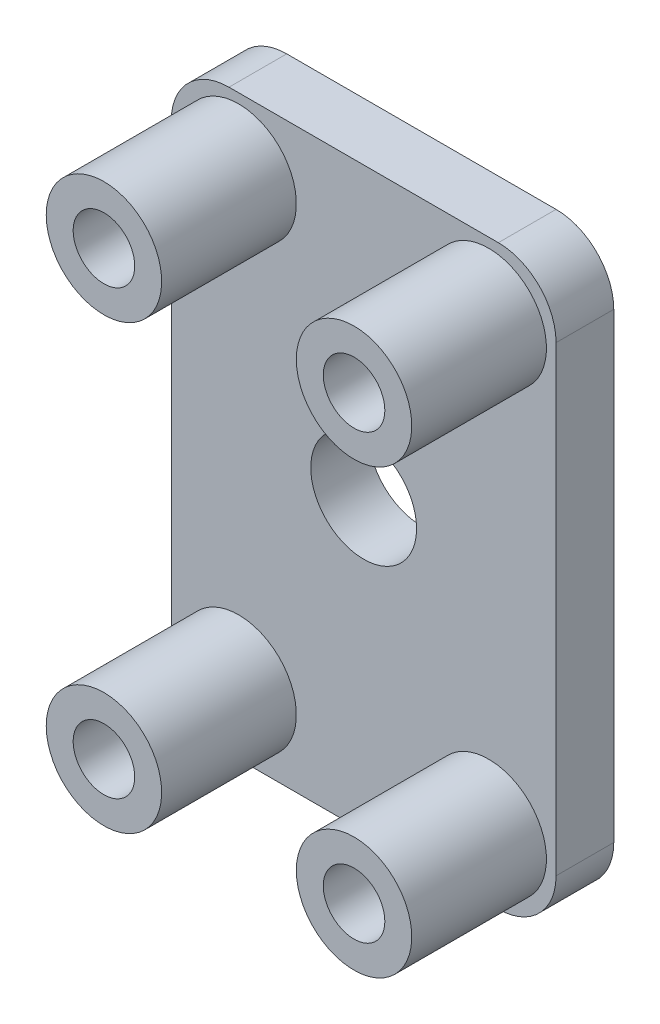
ISO-10303-21;
HEADER;
FILE_DESCRIPTION(('STEP AP214'),'2;1');
FILE_NAME('part.step','',(''),(''),'','','');
FILE_SCHEMA(('AUTOMOTIVE_DESIGN { 1 0 10303 214 1 1 1 1 }'));
ENDSEC;
DATA;
#1=APPLICATION_CONTEXT('core data for automotive mechanical design processes');
#2=APPLICATION_PROTOCOL_DEFINITION('international standard','automotive_design',2000,#1);
#3=PRODUCT_CONTEXT('',#1,'mechanical');
#4=PRODUCT('Part','Part','',(#3));
#5=PRODUCT_RELATED_PRODUCT_CATEGORY('part','',(#4));
#6=PRODUCT_DEFINITION_FORMATION('','',#4);
#7=PRODUCT_DEFINITION_CONTEXT('part definition',#1,'design');
#8=PRODUCT_DEFINITION('design','',#6,#7);
#9=PRODUCT_DEFINITION_SHAPE('','',#8);
#10=(LENGTH_UNIT() NAMED_UNIT(*) SI_UNIT(.MILLI.,.METRE.));
#11=(NAMED_UNIT(*) PLANE_ANGLE_UNIT() SI_UNIT($,.RADIAN.));
#12=(NAMED_UNIT(*) SI_UNIT($,.STERADIAN.) SOLID_ANGLE_UNIT());
#13=UNCERTAINTY_MEASURE_WITH_UNIT(LENGTH_MEASURE(1.E-05),#10,'distance_accuracy_value','');
#14=(GEOMETRIC_REPRESENTATION_CONTEXT(3) GLOBAL_UNCERTAINTY_ASSIGNED_CONTEXT((#13)) GLOBAL_UNIT_ASSIGNED_CONTEXT((#10,
#11,#12)) REPRESENTATION_CONTEXT('',''));
#15=CARTESIAN_POINT('',(0.,0.,0.));
#16=DIRECTION('',(0.,0.,1.));
#17=DIRECTION('',(1.,0.,0.));
#18=AXIS2_PLACEMENT_3D('',#15,#16,#17);
#19=CARTESIAN_POINT('',(0.,0.,3.));
#20=DIRECTION('',(0.,0.,-1.));
#21=DIRECTION('',(-1.,0.,0.));
#22=AXIS2_PLACEMENT_3D('',#19,#20,#21);
#23=PLANE('',#22);
#24=CARTESIAN_POINT('',(0.,0.,3.));
#25=DIRECTION('',(0.,0.,1.));
#26=DIRECTION('',(1.,0.,0.));
#27=AXIS2_PLACEMENT_3D('',#24,#25,#26);
#28=CIRCLE('',#27,2.75);
#29=CARTESIAN_POINT('',(2.75,0.,3.));
#30=VERTEX_POINT('',#29);
#31=EDGE_CURVE('E205',#30,#30,#28,.T.);
#32=ORIENTED_EDGE('',*,*,#31,.F.);
#33=EDGE_LOOP('',(#32));
#34=FACE_BOUND('',#33,.T.);
#35=CARTESIAN_POINT('',(6.5,-11.5,3.));
#36=DIRECTION('',(0.,0.,-1.));
#37=DIRECTION('',(-1.,0.,0.));
#38=AXIS2_PLACEMENT_3D('',#35,#36,#37);
#39=CIRCLE('',#38,3.);
#40=CARTESIAN_POINT('',(3.5,-11.5,3.));
#41=VERTEX_POINT('',#40);
#42=EDGE_CURVE('E148',#41,#41,#39,.F.);
#43=ORIENTED_EDGE('',*,*,#42,.F.);
#44=EDGE_LOOP('',(#43));
#45=FACE_BOUND('',#44,.T.);
#46=CARTESIAN_POINT('',(-6.5,11.5,3.));
#47=DIRECTION('',(0.,0.,-1.));
#48=DIRECTION('',(-1.,0.,0.));
#49=AXIS2_PLACEMENT_3D('',#46,#47,#48);
#50=CIRCLE('',#49,3.);
#51=CARTESIAN_POINT('',(-9.5,11.5,3.));
#52=VERTEX_POINT('',#51);
#53=EDGE_CURVE('E142',#52,#52,#50,.F.);
#54=ORIENTED_EDGE('',*,*,#53,.F.);
#55=EDGE_LOOP('',(#54));
#56=FACE_BOUND('',#55,.T.);
#57=DIRECTION('',(1.,0.,0.));
#58=VECTOR('',#57,1.);
#59=CARTESIAN_POINT('',(-10.,-15.,3.));
#60=LINE('',#59,#58);
#61=CARTESIAN_POINT('',(-7.,-15.,3.));
#62=VERTEX_POINT('',#61);
#63=CARTESIAN_POINT('',(7.,-15.,3.));
#64=VERTEX_POINT('',#63);
#65=EDGE_CURVE('E136',#62,#64,#60,.T.);
#66=ORIENTED_EDGE('',*,*,#65,.T.);
#67=CARTESIAN_POINT('',(7.,-12.,3.));
#68=DIRECTION('',(0.,0.,-1.));
#69=DIRECTION('',(-1.,0.,0.));
#70=AXIS2_PLACEMENT_3D('',#67,#68,#69);
#71=CIRCLE('',#70,3.);
#72=CARTESIAN_POINT('',(10.,-12.,3.));
#73=VERTEX_POINT('',#72);
#74=EDGE_CURVE('E171',#64,#73,#71,.F.);
#75=ORIENTED_EDGE('',*,*,#74,.T.);
#76=DIRECTION('',(0.,1.,0.));
#77=VECTOR('',#76,1.);
#78=CARTESIAN_POINT('',(10.,-15.,3.));
#79=LINE('',#78,#77);
#80=CARTESIAN_POINT('',(10.,12.,3.));
#81=VERTEX_POINT('',#80);
#82=EDGE_CURVE('E120',#73,#81,#79,.T.);
#83=ORIENTED_EDGE('',*,*,#82,.T.);
#84=CARTESIAN_POINT('',(7.,12.,3.));
#85=DIRECTION('',(0.,0.,-1.));
#86=DIRECTION('',(-1.,0.,0.));
#87=AXIS2_PLACEMENT_3D('',#84,#85,#86);
#88=CIRCLE('',#87,3.);
#89=CARTESIAN_POINT('',(7.,15.,3.));
#90=VERTEX_POINT('',#89);
#91=EDGE_CURVE('E166',#81,#90,#88,.F.);
#92=ORIENTED_EDGE('',*,*,#91,.T.);
#93=DIRECTION('',(-1.,0.,0.));
#94=VECTOR('',#93,1.);
#95=CARTESIAN_POINT('',(-10.,15.,3.));
#96=LINE('',#95,#94);
#97=CARTESIAN_POINT('',(-7.,15.,3.));
#98=VERTEX_POINT('',#97);
#99=EDGE_CURVE('E182',#90,#98,#96,.T.);
#100=ORIENTED_EDGE('',*,*,#99,.T.);
#101=CARTESIAN_POINT('',(-7.,12.,3.));
#102=DIRECTION('',(0.,0.,-1.));
#103=DIRECTION('',(-1.,0.,0.));
#104=AXIS2_PLACEMENT_3D('',#101,#102,#103);
#105=CIRCLE('',#104,3.);
#106=CARTESIAN_POINT('',(-10.,12.,3.));
#107=VERTEX_POINT('',#106);
#108=EDGE_CURVE('E56',#98,#107,#105,.F.);
#109=ORIENTED_EDGE('',*,*,#108,.T.);
#110=DIRECTION('',(0.,-1.,0.));
#111=VECTOR('',#110,1.);
#112=CARTESIAN_POINT('',(-10.,-15.,3.));
#113=LINE('',#112,#111);
#114=CARTESIAN_POINT('',(-10.,-12.,3.));
#115=VERTEX_POINT('',#114);
#116=EDGE_CURVE('E190',#107,#115,#113,.T.);
#117=ORIENTED_EDGE('',*,*,#116,.T.);
#118=CARTESIAN_POINT('',(-7.,-12.,3.));
#119=DIRECTION('',(0.,0.,-1.));
#120=DIRECTION('',(-1.,0.,0.));
#121=AXIS2_PLACEMENT_3D('',#118,#119,#120);
#122=CIRCLE('',#121,3.);
#123=EDGE_CURVE('E169',#115,#62,#122,.F.);
#124=ORIENTED_EDGE('',*,*,#123,.T.);
#125=EDGE_LOOP('',(#66,#75,#83,#92,#100,#109,#117,#124));
#126=FACE_BOUND('',#125,.T.);
#127=CARTESIAN_POINT('',(6.5,11.5,3.));
#128=DIRECTION('',(0.,0.,-1.));
#129=DIRECTION('',(-1.,0.,0.));
#130=AXIS2_PLACEMENT_3D('',#127,#128,#129);
#131=CIRCLE('',#130,3.);
#132=CARTESIAN_POINT('',(3.5,11.5,3.));
#133=VERTEX_POINT('',#132);
#134=EDGE_CURVE('E145',#133,#133,#131,.F.);
#135=ORIENTED_EDGE('',*,*,#134,.F.);
#136=EDGE_LOOP('',(#135));
#137=FACE_BOUND('',#136,.T.);
#138=CARTESIAN_POINT('',(-6.5,-11.5,3.));
#139=DIRECTION('',(0.,0.,-1.));
#140=DIRECTION('',(-1.,0.,0.));
#141=AXIS2_PLACEMENT_3D('',#138,#139,#140);
#142=CIRCLE('',#141,3.);
#143=CARTESIAN_POINT('',(-9.5,-11.5,3.));
#144=VERTEX_POINT('',#143);
#145=EDGE_CURVE('E151',#144,#144,#142,.F.);
#146=ORIENTED_EDGE('',*,*,#145,.F.);
#147=EDGE_LOOP('',(#146));
#148=FACE_BOUND('',#147,.T.);
#149=ADVANCED_FACE('F34',(#34,#45,#56,#126,#137,#148),#23,.F.);
#150=CARTESIAN_POINT('',(10.,-15.,3.));
#151=DIRECTION('',(-1.,0.,0.));
#152=DIRECTION('',(0.,0.,1.));
#153=AXIS2_PLACEMENT_3D('',#150,#151,#152);
#154=PLANE('',#153);
#155=ORIENTED_EDGE('',*,*,#82,.F.);
#156=DIRECTION('',(0.,0.,-1.));
#157=VECTOR('',#156,1.);
#158=CARTESIAN_POINT('',(10.,-12.,3.));
#159=LINE('',#158,#157);
#160=CARTESIAN_POINT('',(10.,-12.,0.));
#161=VERTEX_POINT('',#160);
#162=EDGE_CURVE('E104',#73,#161,#159,.T.);
#163=ORIENTED_EDGE('',*,*,#162,.T.);
#164=DIRECTION('',(0.,1.,0.));
#165=VECTOR('',#164,1.);
#166=CARTESIAN_POINT('',(10.,-15.,0.));
#167=LINE('',#166,#165);
#168=CARTESIAN_POINT('',(10.,12.,0.));
#169=VERTEX_POINT('',#168);
#170=EDGE_CURVE('E117',#161,#169,#167,.T.);
#171=ORIENTED_EDGE('',*,*,#170,.T.);
#172=DIRECTION('',(0.,0.,-1.));
#173=VECTOR('',#172,1.);
#174=CARTESIAN_POINT('',(10.,12.,3.));
#175=LINE('',#174,#173);
#176=EDGE_CURVE('E122',#169,#81,#175,.F.);
#177=ORIENTED_EDGE('',*,*,#176,.T.);
#178=EDGE_LOOP('',(#155,#163,#171,#177));
#179=FACE_BOUND('',#178,.T.);
#180=ADVANCED_FACE('F116',(#179),#154,.F.);
#181=CARTESIAN_POINT('',(-10.,15.,3.));
#182=DIRECTION('',(0.,-1.,0.));
#183=DIRECTION('',(0.,0.,-1.));
#184=AXIS2_PLACEMENT_3D('',#181,#182,#183);
#185=PLANE('',#184);
#186=DIRECTION('',(-1.,0.,0.));
#187=VECTOR('',#186,1.);
#188=CARTESIAN_POINT('',(-10.,15.,0.));
#189=LINE('',#188,#187);
#190=CARTESIAN_POINT('',(7.,15.,0.));
#191=VERTEX_POINT('',#190);
#192=CARTESIAN_POINT('',(-7.,15.,0.));
#193=VERTEX_POINT('',#192);
#194=EDGE_CURVE('E126',#191,#193,#189,.T.);
#195=ORIENTED_EDGE('',*,*,#194,.T.);
#196=DIRECTION('',(0.,0.,-1.));
#197=VECTOR('',#196,1.);
#198=CARTESIAN_POINT('',(-7.,15.,3.));
#199=LINE('',#198,#197);
#200=EDGE_CURVE('E11',#193,#98,#199,.F.);
#201=ORIENTED_EDGE('',*,*,#200,.T.);
#202=ORIENTED_EDGE('',*,*,#99,.F.);
#203=DIRECTION('',(0.,0.,-1.));
#204=VECTOR('',#203,1.);
#205=CARTESIAN_POINT('',(7.,15.,3.));
#206=LINE('',#205,#204);
#207=EDGE_CURVE('E42',#90,#191,#206,.T.);
#208=ORIENTED_EDGE('',*,*,#207,.T.);
#209=EDGE_LOOP('',(#195,#201,#202,#208));
#210=FACE_BOUND('',#209,.T.);
#211=ADVANCED_FACE('F180',(#210),#185,.F.);
#212=CARTESIAN_POINT('',(-10.,-15.,3.));
#213=DIRECTION('',(1.,0.,0.));
#214=DIRECTION('',(0.,0.,-1.));
#215=AXIS2_PLACEMENT_3D('',#212,#213,#214);
#216=PLANE('',#215);
#217=DIRECTION('',(0.,-1.,0.));
#218=VECTOR('',#217,1.);
#219=CARTESIAN_POINT('',(-10.,-15.,0.));
#220=LINE('',#219,#218);
#221=CARTESIAN_POINT('',(-10.,12.,0.));
#222=VERTEX_POINT('',#221);
#223=CARTESIAN_POINT('',(-10.,-12.,0.));
#224=VERTEX_POINT('',#223);
#225=EDGE_CURVE('E130',#222,#224,#220,.T.);
#226=ORIENTED_EDGE('',*,*,#225,.T.);
#227=DIRECTION('',(0.,0.,-1.));
#228=VECTOR('',#227,1.);
#229=CARTESIAN_POINT('',(-10.,-12.,3.));
#230=LINE('',#229,#228);
#231=EDGE_CURVE('E49',#224,#115,#230,.F.);
#232=ORIENTED_EDGE('',*,*,#231,.T.);
#233=ORIENTED_EDGE('',*,*,#116,.F.);
#234=DIRECTION('',(0.,0.,-1.));
#235=VECTOR('',#234,1.);
#236=CARTESIAN_POINT('',(-10.,12.,3.));
#237=LINE('',#236,#235);
#238=EDGE_CURVE('E173',#107,#222,#237,.T.);
#239=ORIENTED_EDGE('',*,*,#238,.T.);
#240=EDGE_LOOP('',(#226,#232,#233,#239));
#241=FACE_BOUND('',#240,.T.);
#242=ADVANCED_FACE('F189',(#241),#216,.F.);
#243=CARTESIAN_POINT('',(-10.,-15.,3.));
#244=DIRECTION('',(0.,1.,0.));
#245=DIRECTION('',(0.,0.,1.));
#246=AXIS2_PLACEMENT_3D('',#243,#244,#245);
#247=PLANE('',#246);
#248=DIRECTION('',(1.,0.,0.));
#249=VECTOR('',#248,1.);
#250=CARTESIAN_POINT('',(-10.,-15.,0.));
#251=LINE('',#250,#249);
#252=CARTESIAN_POINT('',(-7.,-15.,0.));
#253=VERTEX_POINT('',#252);
#254=CARTESIAN_POINT('',(7.,-15.,0.));
#255=VERTEX_POINT('',#254);
#256=EDGE_CURVE('E140',#253,#255,#251,.T.);
#257=ORIENTED_EDGE('',*,*,#256,.T.);
#258=DIRECTION('',(0.,0.,-1.));
#259=VECTOR('',#258,1.);
#260=CARTESIAN_POINT('',(7.,-15.,3.));
#261=LINE('',#260,#259);
#262=EDGE_CURVE('E105',#255,#64,#261,.F.);
#263=ORIENTED_EDGE('',*,*,#262,.T.);
#264=ORIENTED_EDGE('',*,*,#65,.F.);
#265=DIRECTION('',(0.,0.,-1.));
#266=VECTOR('',#265,1.);
#267=CARTESIAN_POINT('',(-7.,-15.,3.));
#268=LINE('',#267,#266);
#269=EDGE_CURVE('E110',#62,#253,#268,.T.);
#270=ORIENTED_EDGE('',*,*,#269,.T.);
#271=EDGE_LOOP('',(#257,#263,#264,#270));
#272=FACE_BOUND('',#271,.T.);
#273=ADVANCED_FACE('F252',(#272),#247,.F.);
#274=CARTESIAN_POINT('',(0.,0.,0.));
#275=DIRECTION('',(0.,0.,-1.));
#276=DIRECTION('',(-1.,0.,0.));
#277=AXIS2_PLACEMENT_3D('',#274,#275,#276);
#278=PLANE('',#277);
#279=CARTESIAN_POINT('',(0.,0.,0.));
#280=DIRECTION('',(0.,0.,1.));
#281=DIRECTION('',(1.,0.,0.));
#282=AXIS2_PLACEMENT_3D('',#279,#280,#281);
#283=CIRCLE('',#282,2.75);
#284=CARTESIAN_POINT('',(2.75,0.,0.));
#285=VERTEX_POINT('',#284);
#286=EDGE_CURVE('E204',#285,#285,#283,.T.);
#287=ORIENTED_EDGE('',*,*,#286,.T.);
#288=EDGE_LOOP('',(#287));
#289=FACE_BOUND('',#288,.T.);
#290=CARTESIAN_POINT('',(-6.5,11.5,0.));
#291=DIRECTION('',(0.,0.,1.));
#292=DIRECTION('',(1.,0.,0.));
#293=AXIS2_PLACEMENT_3D('',#290,#291,#292);
#294=CIRCLE('',#293,1.6);
#295=CARTESIAN_POINT('',(-4.9,11.5,0.));
#296=VERTEX_POINT('',#295);
#297=EDGE_CURVE('E201',#296,#296,#294,.T.);
#298=ORIENTED_EDGE('',*,*,#297,.T.);
#299=EDGE_LOOP('',(#298));
#300=FACE_BOUND('',#299,.T.);
#301=CARTESIAN_POINT('',(6.5,11.5,0.));
#302=DIRECTION('',(0.,0.,1.));
#303=DIRECTION('',(1.,0.,0.));
#304=AXIS2_PLACEMENT_3D('',#301,#302,#303);
#305=CIRCLE('',#304,1.6);
#306=CARTESIAN_POINT('',(8.1,11.5,0.));
#307=VERTEX_POINT('',#306);
#308=EDGE_CURVE('E198',#307,#307,#305,.T.);
#309=ORIENTED_EDGE('',*,*,#308,.T.);
#310=EDGE_LOOP('',(#309));
#311=FACE_BOUND('',#310,.T.);
#312=CARTESIAN_POINT('',(6.5,-11.5,0.));
#313=DIRECTION('',(0.,0.,1.));
#314=DIRECTION('',(1.,0.,0.));
#315=AXIS2_PLACEMENT_3D('',#312,#313,#314);
#316=CIRCLE('',#315,1.6);
#317=CARTESIAN_POINT('',(8.1,-11.5,0.));
#318=VERTEX_POINT('',#317);
#319=EDGE_CURVE('E133',#318,#318,#316,.T.);
#320=ORIENTED_EDGE('',*,*,#319,.T.);
#321=EDGE_LOOP('',(#320));
#322=FACE_BOUND('',#321,.T.);
#323=CARTESIAN_POINT('',(-6.5,-11.5,0.));
#324=DIRECTION('',(0.,0.,1.));
#325=DIRECTION('',(1.,0.,0.));
#326=AXIS2_PLACEMENT_3D('',#323,#324,#325);
#327=CIRCLE('',#326,1.6);
#328=CARTESIAN_POINT('',(-4.9,-11.5,0.));
#329=VERTEX_POINT('',#328);
#330=EDGE_CURVE('E127',#329,#329,#327,.T.);
#331=ORIENTED_EDGE('',*,*,#330,.T.);
#332=EDGE_LOOP('',(#331));
#333=FACE_BOUND('',#332,.T.);
#334=ORIENTED_EDGE('',*,*,#170,.F.);
#335=CARTESIAN_POINT('',(7.,-12.,0.));
#336=DIRECTION('',(0.,0.,-1.));
#337=DIRECTION('',(-1.,0.,0.));
#338=AXIS2_PLACEMENT_3D('',#335,#336,#337);
#339=CIRCLE('',#338,3.);
#340=EDGE_CURVE('E100',#161,#255,#339,.T.);
#341=ORIENTED_EDGE('',*,*,#340,.T.);
#342=ORIENTED_EDGE('',*,*,#256,.F.);
#343=CARTESIAN_POINT('',(-7.,-12.,0.));
#344=DIRECTION('',(0.,0.,-1.));
#345=DIRECTION('',(-1.,0.,0.));
#346=AXIS2_PLACEMENT_3D('',#343,#344,#345);
#347=CIRCLE('',#346,3.);
#348=EDGE_CURVE('E111',#253,#224,#347,.T.);
#349=ORIENTED_EDGE('',*,*,#348,.T.);
#350=ORIENTED_EDGE('',*,*,#225,.F.);
#351=CARTESIAN_POINT('',(-7.,12.,0.));
#352=DIRECTION('',(0.,0.,-1.));
#353=DIRECTION('',(-1.,0.,0.));
#354=AXIS2_PLACEMENT_3D('',#351,#352,#353);
#355=CIRCLE('',#354,3.);
#356=EDGE_CURVE('E160',#222,#193,#355,.T.);
#357=ORIENTED_EDGE('',*,*,#356,.T.);
#358=ORIENTED_EDGE('',*,*,#194,.F.);
#359=CARTESIAN_POINT('',(7.,12.,0.));
#360=DIRECTION('',(0.,0.,-1.));
#361=DIRECTION('',(-1.,0.,0.));
#362=AXIS2_PLACEMENT_3D('',#359,#360,#361);
#363=CIRCLE('',#362,3.);
#364=EDGE_CURVE('E121',#191,#169,#363,.T.);
#365=ORIENTED_EDGE('',*,*,#364,.T.);
#366=EDGE_LOOP('',(#334,#341,#342,#349,#350,#357,#358,#365));
#367=FACE_BOUND('',#366,.T.);
#368=ADVANCED_FACE('F124',(#289,#300,#311,#322,#333,#367),#278,.T.);
#369=CARTESIAN_POINT('',(-6.5,-11.5,3.));
#370=DIRECTION('',(0.,0.,1.));
#371=DIRECTION('',(1.,0.,0.));
#372=AXIS2_PLACEMENT_3D('',#369,#370,#371);
#373=CYLINDRICAL_SURFACE('',#372,1.6);
#374=CARTESIAN_POINT('',(-6.5,-11.5,10.));
#375=DIRECTION('',(0.,0.,-1.));
#376=DIRECTION('',(0.,1.,0.));
#377=AXIS2_PLACEMENT_3D('',#374,#375,#376);
#378=CIRCLE('',#377,1.6);
#379=CARTESIAN_POINT('',(-6.5,-9.9,10.));
#380=VERTEX_POINT('',#379);
#381=EDGE_CURVE('E208',#380,#380,#378,.F.);
#382=ORIENTED_EDGE('',*,*,#381,.T.);
#383=EDGE_LOOP('',(#382));
#384=FACE_BOUND('',#383,.T.);
#385=ORIENTED_EDGE('',*,*,#330,.F.);
#386=EDGE_LOOP('',(#385));
#387=FACE_BOUND('',#386,.T.);
#388=ADVANCED_FACE('F246',(#384,#387),#373,.F.);
#389=CARTESIAN_POINT('',(6.5,-11.5,3.));
#390=DIRECTION('',(0.,0.,1.));
#391=DIRECTION('',(1.,0.,0.));
#392=AXIS2_PLACEMENT_3D('',#389,#390,#391);
#393=CYLINDRICAL_SURFACE('',#392,1.6);
#394=CARTESIAN_POINT('',(6.5,-11.5,10.));
#395=DIRECTION('',(0.,0.,-1.));
#396=DIRECTION('',(0.,1.,0.));
#397=AXIS2_PLACEMENT_3D('',#394,#395,#396);
#398=CIRCLE('',#397,1.6);
#399=CARTESIAN_POINT('',(6.5,-9.9,10.));
#400=VERTEX_POINT('',#399);
#401=EDGE_CURVE('E213',#400,#400,#398,.F.);
#402=ORIENTED_EDGE('',*,*,#401,.T.);
#403=EDGE_LOOP('',(#402));
#404=FACE_BOUND('',#403,.T.);
#405=ORIENTED_EDGE('',*,*,#319,.F.);
#406=EDGE_LOOP('',(#405));
#407=FACE_BOUND('',#406,.T.);
#408=ADVANCED_FACE('F242',(#404,#407),#393,.F.);
#409=CARTESIAN_POINT('',(6.5,11.5,3.));
#410=DIRECTION('',(0.,0.,1.));
#411=DIRECTION('',(1.,0.,0.));
#412=AXIS2_PLACEMENT_3D('',#409,#410,#411);
#413=CYLINDRICAL_SURFACE('',#412,1.6);
#414=CARTESIAN_POINT('',(6.5,11.5,10.));
#415=DIRECTION('',(0.,0.,-1.));
#416=DIRECTION('',(0.,1.,0.));
#417=AXIS2_PLACEMENT_3D('',#414,#415,#416);
#418=CIRCLE('',#417,1.6);
#419=CARTESIAN_POINT('',(6.5,13.1,10.));
#420=VERTEX_POINT('',#419);
#421=EDGE_CURVE('E216',#420,#420,#418,.F.);
#422=ORIENTED_EDGE('',*,*,#421,.T.);
#423=EDGE_LOOP('',(#422));
#424=FACE_BOUND('',#423,.T.);
#425=ORIENTED_EDGE('',*,*,#308,.F.);
#426=EDGE_LOOP('',(#425));
#427=FACE_BOUND('',#426,.T.);
#428=ADVANCED_FACE('F245',(#424,#427),#413,.F.);
#429=CARTESIAN_POINT('',(-6.5,11.5,3.));
#430=DIRECTION('',(0.,0.,1.));
#431=DIRECTION('',(1.,0.,0.));
#432=AXIS2_PLACEMENT_3D('',#429,#430,#431);
#433=CYLINDRICAL_SURFACE('',#432,1.6);
#434=CARTESIAN_POINT('',(-6.5,11.5,10.));
#435=DIRECTION('',(0.,0.,-1.));
#436=DIRECTION('',(0.,1.,0.));
#437=AXIS2_PLACEMENT_3D('',#434,#435,#436);
#438=CIRCLE('',#437,1.6);
#439=CARTESIAN_POINT('',(-6.5,13.1,10.));
#440=VERTEX_POINT('',#439);
#441=EDGE_CURVE('E219',#440,#440,#438,.F.);
#442=ORIENTED_EDGE('',*,*,#441,.T.);
#443=EDGE_LOOP('',(#442));
#444=FACE_BOUND('',#443,.T.);
#445=ORIENTED_EDGE('',*,*,#297,.F.);
#446=EDGE_LOOP('',(#445));
#447=FACE_BOUND('',#446,.T.);
#448=ADVANCED_FACE('F318',(#444,#447),#433,.F.);
#449=CARTESIAN_POINT('',(-6.5,11.5,23.));
#450=DIRECTION('',(0.,0.,-1.));
#451=DIRECTION('',(-1.,0.,0.));
#452=AXIS2_PLACEMENT_3D('',#449,#450,#451);
#453=CYLINDRICAL_SURFACE('',#452,3.);
#454=CARTESIAN_POINT('',(-6.5,11.5,10.));
#455=DIRECTION('',(0.,0.,-1.));
#456=DIRECTION('',(0.,1.,0.));
#457=AXIS2_PLACEMENT_3D('',#454,#455,#456);
#458=CIRCLE('',#457,3.);
#459=CARTESIAN_POINT('',(-6.5,14.5,10.));
#460=VERTEX_POINT('',#459);
#461=EDGE_CURVE('E222',#460,#460,#458,.T.);
#462=ORIENTED_EDGE('',*,*,#461,.T.);
#463=EDGE_LOOP('',(#462));
#464=FACE_BOUND('',#463,.T.);
#465=ORIENTED_EDGE('',*,*,#53,.T.);
#466=EDGE_LOOP('',(#465));
#467=FACE_BOUND('',#466,.T.);
#468=ADVANCED_FACE('F314',(#464,#467),#453,.T.);
#469=CARTESIAN_POINT('',(6.5,11.5,23.));
#470=DIRECTION('',(0.,0.,-1.));
#471=DIRECTION('',(-1.,0.,0.));
#472=AXIS2_PLACEMENT_3D('',#469,#470,#471);
#473=CYLINDRICAL_SURFACE('',#472,3.);
#474=CARTESIAN_POINT('',(6.5,11.5,10.));
#475=DIRECTION('',(0.,0.,-1.));
#476=DIRECTION('',(0.,1.,0.));
#477=AXIS2_PLACEMENT_3D('',#474,#475,#476);
#478=CIRCLE('',#477,3.);
#479=CARTESIAN_POINT('',(6.5,14.5,10.));
#480=VERTEX_POINT('',#479);
#481=EDGE_CURVE('E225',#480,#480,#478,.T.);
#482=ORIENTED_EDGE('',*,*,#481,.T.);
#483=EDGE_LOOP('',(#482));
#484=FACE_BOUND('',#483,.T.);
#485=ORIENTED_EDGE('',*,*,#134,.T.);
#486=EDGE_LOOP('',(#485));
#487=FACE_BOUND('',#486,.T.);
#488=ADVANCED_FACE('F309',(#484,#487),#473,.T.);
#489=CARTESIAN_POINT('',(6.5,-11.5,23.));
#490=DIRECTION('',(0.,0.,-1.));
#491=DIRECTION('',(-1.,0.,0.));
#492=AXIS2_PLACEMENT_3D('',#489,#490,#491);
#493=CYLINDRICAL_SURFACE('',#492,3.);
#494=CARTESIAN_POINT('',(6.5,-11.5,10.));
#495=DIRECTION('',(0.,0.,-1.));
#496=DIRECTION('',(0.,1.,0.));
#497=AXIS2_PLACEMENT_3D('',#494,#495,#496);
#498=CIRCLE('',#497,3.);
#499=CARTESIAN_POINT('',(6.5,-8.5,10.));
#500=VERTEX_POINT('',#499);
#501=EDGE_CURVE('E157',#500,#500,#498,.T.);
#502=ORIENTED_EDGE('',*,*,#501,.T.);
#503=EDGE_LOOP('',(#502));
#504=FACE_BOUND('',#503,.T.);
#505=ORIENTED_EDGE('',*,*,#42,.T.);
#506=EDGE_LOOP('',(#505));
#507=FACE_BOUND('',#506,.T.);
#508=ADVANCED_FACE('F231',(#504,#507),#493,.T.);
#509=CARTESIAN_POINT('',(-6.5,-11.5,23.));
#510=DIRECTION('',(0.,0.,-1.));
#511=DIRECTION('',(-1.,0.,0.));
#512=AXIS2_PLACEMENT_3D('',#509,#510,#511);
#513=CYLINDRICAL_SURFACE('',#512,3.);
#514=CARTESIAN_POINT('',(-6.5,-11.5,10.));
#515=DIRECTION('',(0.,0.,-1.));
#516=DIRECTION('',(0.,1.,0.));
#517=AXIS2_PLACEMENT_3D('',#514,#515,#516);
#518=CIRCLE('',#517,3.);
#519=CARTESIAN_POINT('',(-6.5,-8.5,10.));
#520=VERTEX_POINT('',#519);
#521=EDGE_CURVE('E154',#520,#520,#518,.T.);
#522=ORIENTED_EDGE('',*,*,#521,.T.);
#523=EDGE_LOOP('',(#522));
#524=FACE_BOUND('',#523,.T.);
#525=ORIENTED_EDGE('',*,*,#145,.T.);
#526=EDGE_LOOP('',(#525));
#527=FACE_BOUND('',#526,.T.);
#528=ADVANCED_FACE('F298',(#524,#527),#513,.T.);
#529=CARTESIAN_POINT('',(0.,0.,0.));
#530=DIRECTION('',(0.,0.,1.));
#531=DIRECTION('',(1.,0.,0.));
#532=AXIS2_PLACEMENT_3D('',#529,#530,#531);
#533=CYLINDRICAL_SURFACE('',#532,2.75);
#534=ORIENTED_EDGE('',*,*,#286,.F.);
#535=EDGE_LOOP('',(#534));
#536=FACE_BOUND('',#535,.T.);
#537=ORIENTED_EDGE('',*,*,#31,.T.);
#538=EDGE_LOOP('',(#537));
#539=FACE_BOUND('',#538,.T.);
#540=ADVANCED_FACE('F300',(#536,#539),#533,.F.);
#541=CARTESIAN_POINT('',(-10.,20.,10.));
#542=DIRECTION('',(0.,0.,-1.));
#543=DIRECTION('',(0.,1.,0.));
#544=AXIS2_PLACEMENT_3D('',#541,#542,#543);
#545=PLANE('',#544);
#546=ORIENTED_EDGE('',*,*,#521,.F.);
#547=EDGE_LOOP('',(#546));
#548=FACE_BOUND('',#547,.T.);
#549=ORIENTED_EDGE('',*,*,#381,.F.);
#550=EDGE_LOOP('',(#549));
#551=FACE_BOUND('',#550,.T.);
#552=ADVANCED_FACE('F238',(#548,#551),#545,.F.);
#553=ORIENTED_EDGE('',*,*,#501,.F.);
#554=EDGE_LOOP('',(#553));
#555=FACE_BOUND('',#554,.T.);
#556=ORIENTED_EDGE('',*,*,#401,.F.);
#557=EDGE_LOOP('',(#556));
#558=FACE_BOUND('',#557,.T.);
#559=ADVANCED_FACE('F234',(#555,#558),#545,.F.);
#560=ORIENTED_EDGE('',*,*,#481,.F.);
#561=EDGE_LOOP('',(#560));
#562=FACE_BOUND('',#561,.T.);
#563=ORIENTED_EDGE('',*,*,#421,.F.);
#564=EDGE_LOOP('',(#563));
#565=FACE_BOUND('',#564,.T.);
#566=ADVANCED_FACE('F237',(#562,#565),#545,.F.);
#567=ORIENTED_EDGE('',*,*,#461,.F.);
#568=EDGE_LOOP('',(#567));
#569=FACE_BOUND('',#568,.T.);
#570=ORIENTED_EDGE('',*,*,#441,.F.);
#571=EDGE_LOOP('',(#570));
#572=FACE_BOUND('',#571,.T.);
#573=ADVANCED_FACE('F282',(#569,#572),#545,.F.);
#574=CARTESIAN_POINT('',(7.,-12.,3.));
#575=DIRECTION('',(0.,0.,-1.));
#576=DIRECTION('',(-1.,0.,0.));
#577=AXIS2_PLACEMENT_3D('',#574,#575,#576);
#578=CYLINDRICAL_SURFACE('',#577,3.);
#579=ORIENTED_EDGE('',*,*,#74,.F.);
#580=ORIENTED_EDGE('',*,*,#262,.F.);
#581=ORIENTED_EDGE('',*,*,#340,.F.);
#582=ORIENTED_EDGE('',*,*,#162,.F.);
#583=EDGE_LOOP('',(#579,#580,#581,#582));
#584=FACE_BOUND('',#583,.T.);
#585=ADVANCED_FACE('F103',(#584),#578,.T.);
#586=CARTESIAN_POINT('',(-7.,-12.,3.));
#587=DIRECTION('',(0.,0.,-1.));
#588=DIRECTION('',(-1.,0.,0.));
#589=AXIS2_PLACEMENT_3D('',#586,#587,#588);
#590=CYLINDRICAL_SURFACE('',#589,3.);
#591=ORIENTED_EDGE('',*,*,#123,.F.);
#592=ORIENTED_EDGE('',*,*,#231,.F.);
#593=ORIENTED_EDGE('',*,*,#348,.F.);
#594=ORIENTED_EDGE('',*,*,#269,.F.);
#595=EDGE_LOOP('',(#591,#592,#593,#594));
#596=FACE_BOUND('',#595,.T.);
#597=ADVANCED_FACE('F281',(#596),#590,.T.);
#598=CARTESIAN_POINT('',(-7.,12.,3.));
#599=DIRECTION('',(0.,0.,-1.));
#600=DIRECTION('',(-1.,0.,0.));
#601=AXIS2_PLACEMENT_3D('',#598,#599,#600);
#602=CYLINDRICAL_SURFACE('',#601,3.);
#603=ORIENTED_EDGE('',*,*,#108,.F.);
#604=ORIENTED_EDGE('',*,*,#200,.F.);
#605=ORIENTED_EDGE('',*,*,#356,.F.);
#606=ORIENTED_EDGE('',*,*,#238,.F.);
#607=EDGE_LOOP('',(#603,#604,#605,#606));
#608=FACE_BOUND('',#607,.T.);
#609=ADVANCED_FACE('F188',(#608),#602,.T.);
#610=CARTESIAN_POINT('',(7.,12.,3.));
#611=DIRECTION('',(0.,0.,-1.));
#612=DIRECTION('',(-1.,0.,0.));
#613=AXIS2_PLACEMENT_3D('',#610,#611,#612);
#614=CYLINDRICAL_SURFACE('',#613,3.);
#615=ORIENTED_EDGE('',*,*,#91,.F.);
#616=ORIENTED_EDGE('',*,*,#176,.F.);
#617=ORIENTED_EDGE('',*,*,#364,.F.);
#618=ORIENTED_EDGE('',*,*,#207,.F.);
#619=EDGE_LOOP('',(#615,#616,#617,#618));
#620=FACE_BOUND('',#619,.T.);
#621=ADVANCED_FACE('F36',(#620),#614,.T.);
#622=CLOSED_SHELL('',(#149,#180,#211,#242,#273,#368,#388,#408,#428,#448,#468,#488,#508,#528,
#540,#552,#559,#566,#573,#585,#597,#609,#621));
#623=MANIFOLD_SOLID_BREP('B2',#622);
#624=ADVANCED_BREP_SHAPE_REPRESENTATION('',(#18,#623),#14);
#625=SHAPE_DEFINITION_REPRESENTATION(#9,#624);
ENDSEC;
END-ISO-10303-21;
